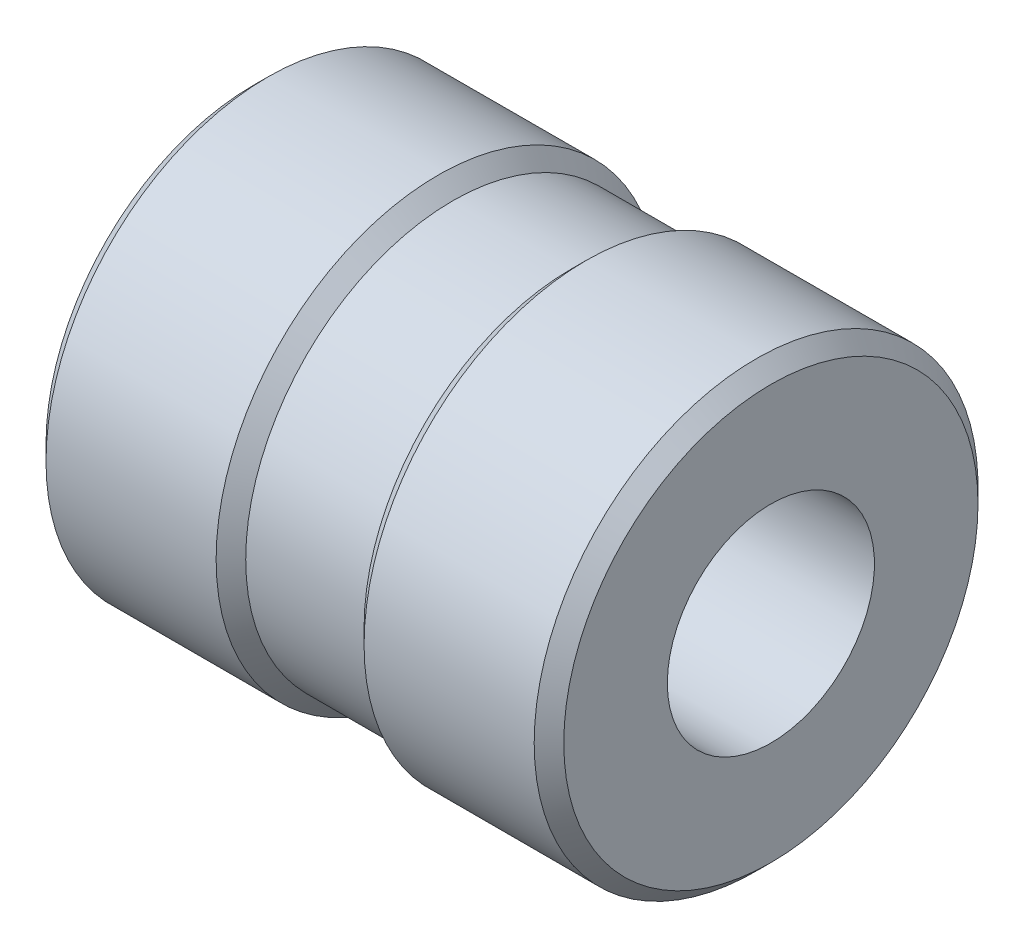
ISO-10303-21;
HEADER;
FILE_DESCRIPTION(('STEP AP214'),'2;1');
FILE_NAME('part.step','',(''),(''),'','','');
FILE_SCHEMA(('AUTOMOTIVE_DESIGN { 1 0 10303 214 1 1 1 1 }'));
ENDSEC;
DATA;
#1=APPLICATION_CONTEXT('core data for automotive mechanical design processes');
#2=APPLICATION_PROTOCOL_DEFINITION('international standard','automotive_design',2000,#1);
#3=PRODUCT_CONTEXT('',#1,'mechanical');
#4=PRODUCT('Part','Part','',(#3));
#5=PRODUCT_RELATED_PRODUCT_CATEGORY('part','',(#4));
#6=PRODUCT_DEFINITION_FORMATION('','',#4);
#7=PRODUCT_DEFINITION_CONTEXT('part definition',#1,'design');
#8=PRODUCT_DEFINITION('design','',#6,#7);
#9=PRODUCT_DEFINITION_SHAPE('','',#8);
#10=(LENGTH_UNIT() NAMED_UNIT(*) SI_UNIT(.MILLI.,.METRE.));
#11=(NAMED_UNIT(*) PLANE_ANGLE_UNIT() SI_UNIT($,.RADIAN.));
#12=(NAMED_UNIT(*) SI_UNIT($,.STERADIAN.) SOLID_ANGLE_UNIT());
#13=UNCERTAINTY_MEASURE_WITH_UNIT(LENGTH_MEASURE(1.E-05),#10,'distance_accuracy_value','');
#14=(GEOMETRIC_REPRESENTATION_CONTEXT(3) GLOBAL_UNCERTAINTY_ASSIGNED_CONTEXT((#13)) GLOBAL_UNIT_ASSIGNED_CONTEXT((#10,
#11,#12)) REPRESENTATION_CONTEXT('',''));
#15=CARTESIAN_POINT('',(0.,0.,0.));
#16=DIRECTION('',(0.,0.,1.));
#17=DIRECTION('',(1.,0.,0.));
#18=AXIS2_PLACEMENT_3D('',#15,#16,#17);
#19=CARTESIAN_POINT('',(0.,0.,0.));
#20=DIRECTION('',(-1.,0.,0.));
#21=DIRECTION('',(0.,0.,1.));
#22=AXIS2_PLACEMENT_3D('',#19,#20,#21);
#23=CYLINDRICAL_SURFACE('',#22,15.);
#24=CARTESIAN_POINT('',(-5.,0.,0.));
#25=DIRECTION('',(-1.,0.,0.));
#26=DIRECTION('',(0.,0.,1.));
#27=AXIS2_PLACEMENT_3D('',#24,#25,#26);
#28=CIRCLE('',#27,15.);
#29=CARTESIAN_POINT('',(-5.,0.,15.));
#30=VERTEX_POINT('',#29);
#31=EDGE_CURVE('E52',#30,#30,#28,.T.);
#32=ORIENTED_EDGE('',*,*,#31,.T.);
#33=EDGE_LOOP('',(#32));
#34=FACE_BOUND('',#33,.T.);
#35=CARTESIAN_POINT('',(-16.5,0.,0.));
#36=DIRECTION('',(1.,0.,0.));
#37=DIRECTION('',(0.,0.,-1.));
#38=AXIS2_PLACEMENT_3D('',#35,#36,#37);
#39=CIRCLE('',#38,15.);
#40=CARTESIAN_POINT('',(-16.5,0.,-15.));
#41=VERTEX_POINT('',#40);
#42=EDGE_CURVE('E60',#41,#41,#39,.T.);
#43=ORIENTED_EDGE('',*,*,#42,.T.);
#44=EDGE_LOOP('',(#43));
#45=FACE_BOUND('',#44,.T.);
#46=ADVANCED_FACE('F41',(#34,#45),#23,.T.);
#47=CARTESIAN_POINT('',(-17.5,15.,0.));
#48=DIRECTION('',(1.,0.,0.));
#49=DIRECTION('',(0.,0.,-1.));
#50=AXIS2_PLACEMENT_3D('',#47,#48,#49);
#51=PLANE('',#50);
#52=CARTESIAN_POINT('',(-17.5,0.,0.));
#53=DIRECTION('',(1.,0.,0.));
#54=DIRECTION('',(0.,0.,-1.));
#55=AXIS2_PLACEMENT_3D('',#52,#53,#54);
#56=CIRCLE('',#55,14.);
#57=CARTESIAN_POINT('',(-17.5,0.,-14.));
#58=VERTEX_POINT('',#57);
#59=EDGE_CURVE('E47',#58,#58,#56,.F.);
#60=ORIENTED_EDGE('',*,*,#59,.T.);
#61=EDGE_LOOP('',(#60));
#62=FACE_BOUND('',#61,.T.);
#63=CARTESIAN_POINT('',(-17.5,0.,0.));
#64=DIRECTION('',(-1.,0.,0.));
#65=DIRECTION('',(0.,0.,1.));
#66=AXIS2_PLACEMENT_3D('',#63,#64,#65);
#67=CIRCLE('',#66,7.);
#68=CARTESIAN_POINT('',(-17.5,0.,7.));
#69=VERTEX_POINT('',#68);
#70=EDGE_CURVE('E68',#69,#69,#67,.T.);
#71=ORIENTED_EDGE('',*,*,#70,.F.);
#72=EDGE_LOOP('',(#71));
#73=FACE_BOUND('',#72,.T.);
#74=ADVANCED_FACE('F120',(#62,#73),#51,.F.);
#75=CARTESIAN_POINT('',(0.,0.,0.));
#76=DIRECTION('',(-1.,0.,0.));
#77=DIRECTION('',(0.,0.,1.));
#78=AXIS2_PLACEMENT_3D('',#75,#76,#77);
#79=CYLINDRICAL_SURFACE('',#78,7.);
#80=CARTESIAN_POINT('',(-3.5,0.,0.));
#81=DIRECTION('',(-1.,0.,0.));
#82=DIRECTION('',(0.,0.,1.));
#83=AXIS2_PLACEMENT_3D('',#80,#81,#82);
#84=CIRCLE('',#83,7.);
#85=CARTESIAN_POINT('',(-3.5,0.,7.));
#86=VERTEX_POINT('',#85);
#87=EDGE_CURVE('E73',#86,#86,#84,.T.);
#88=ORIENTED_EDGE('',*,*,#87,.F.);
#89=EDGE_LOOP('',(#88));
#90=FACE_BOUND('',#89,.T.);
#91=ORIENTED_EDGE('',*,*,#70,.T.);
#92=EDGE_LOOP('',(#91));
#93=FACE_BOUND('',#92,.T.);
#94=ADVANCED_FACE('F125',(#90,#93),#79,.F.);
#95=CARTESIAN_POINT('',(-3.5,7.,0.));
#96=DIRECTION('',(1.,0.,0.));
#97=DIRECTION('',(0.,0.,-1.));
#98=AXIS2_PLACEMENT_3D('',#95,#96,#97);
#99=PLANE('',#98);
#100=CARTESIAN_POINT('',(-3.5,0.,0.));
#101=DIRECTION('',(-1.,0.,0.));
#102=DIRECTION('',(0.,0.,1.));
#103=AXIS2_PLACEMENT_3D('',#100,#101,#102);
#104=CIRCLE('',#103,2.);
#105=CARTESIAN_POINT('',(-3.5,0.,2.));
#106=VERTEX_POINT('',#105);
#107=EDGE_CURVE('E72',#106,#106,#104,.T.);
#108=ORIENTED_EDGE('',*,*,#107,.F.);
#109=EDGE_LOOP('',(#108));
#110=FACE_BOUND('',#109,.T.);
#111=ORIENTED_EDGE('',*,*,#87,.T.);
#112=EDGE_LOOP('',(#111));
#113=FACE_BOUND('',#112,.T.);
#114=ADVANCED_FACE('F127',(#110,#113),#99,.F.);
#115=CARTESIAN_POINT('',(0.,0.,0.));
#116=DIRECTION('',(-1.,0.,0.));
#117=DIRECTION('',(0.,0.,1.));
#118=AXIS2_PLACEMENT_3D('',#115,#116,#117);
#119=CYLINDRICAL_SURFACE('',#118,2.);
#120=CARTESIAN_POINT('',(3.5,0.,0.));
#121=DIRECTION('',(-1.,0.,0.));
#122=DIRECTION('',(0.,0.,1.));
#123=AXIS2_PLACEMENT_3D('',#120,#121,#122);
#124=CIRCLE('',#123,2.);
#125=CARTESIAN_POINT('',(3.5,0.,2.));
#126=VERTEX_POINT('',#125);
#127=EDGE_CURVE('E80',#126,#126,#124,.T.);
#128=ORIENTED_EDGE('',*,*,#127,.F.);
#129=EDGE_LOOP('',(#128));
#130=FACE_BOUND('',#129,.T.);
#131=ORIENTED_EDGE('',*,*,#107,.T.);
#132=EDGE_LOOP('',(#131));
#133=FACE_BOUND('',#132,.T.);
#134=ADVANCED_FACE('F135',(#130,#133),#119,.F.);
#135=CARTESIAN_POINT('',(3.5,2.,0.));
#136=DIRECTION('',(-1.,0.,0.));
#137=DIRECTION('',(0.,0.,1.));
#138=AXIS2_PLACEMENT_3D('',#135,#136,#137);
#139=PLANE('',#138);
#140=CARTESIAN_POINT('',(3.5,0.,0.));
#141=DIRECTION('',(-1.,0.,0.));
#142=DIRECTION('',(0.,0.,1.));
#143=AXIS2_PLACEMENT_3D('',#140,#141,#142);
#144=CIRCLE('',#143,7.);
#145=CARTESIAN_POINT('',(3.5,0.,7.));
#146=VERTEX_POINT('',#145);
#147=EDGE_CURVE('E79',#146,#146,#144,.T.);
#148=ORIENTED_EDGE('',*,*,#147,.F.);
#149=EDGE_LOOP('',(#148));
#150=FACE_BOUND('',#149,.T.);
#151=ORIENTED_EDGE('',*,*,#127,.T.);
#152=EDGE_LOOP('',(#151));
#153=FACE_BOUND('',#152,.T.);
#154=ADVANCED_FACE('F138',(#150,#153),#139,.F.);
#155=CARTESIAN_POINT('',(0.,0.,0.));
#156=DIRECTION('',(-1.,0.,0.));
#157=DIRECTION('',(0.,0.,1.));
#158=AXIS2_PLACEMENT_3D('',#155,#156,#157);
#159=CYLINDRICAL_SURFACE('',#158,7.);
#160=CARTESIAN_POINT('',(17.5,0.,0.));
#161=DIRECTION('',(-1.,0.,0.));
#162=DIRECTION('',(0.,0.,1.));
#163=AXIS2_PLACEMENT_3D('',#160,#161,#162);
#164=CIRCLE('',#163,7.);
#165=CARTESIAN_POINT('',(17.5,0.,7.));
#166=VERTEX_POINT('',#165);
#167=EDGE_CURVE('E81',#166,#166,#164,.T.);
#168=ORIENTED_EDGE('',*,*,#167,.F.);
#169=EDGE_LOOP('',(#168));
#170=FACE_BOUND('',#169,.T.);
#171=ORIENTED_EDGE('',*,*,#147,.T.);
#172=EDGE_LOOP('',(#171));
#173=FACE_BOUND('',#172,.T.);
#174=ADVANCED_FACE('F136',(#170,#173),#159,.F.);
#175=CARTESIAN_POINT('',(17.5,7.,0.));
#176=DIRECTION('',(-1.,0.,0.));
#177=DIRECTION('',(0.,0.,1.));
#178=AXIS2_PLACEMENT_3D('',#175,#176,#177);
#179=PLANE('',#178);
#180=CARTESIAN_POINT('',(17.5,0.,0.));
#181=DIRECTION('',(-1.,0.,0.));
#182=DIRECTION('',(0.,0.,1.));
#183=AXIS2_PLACEMENT_3D('',#180,#181,#182);
#184=CIRCLE('',#183,14.);
#185=CARTESIAN_POINT('',(17.5,0.,14.));
#186=VERTEX_POINT('',#185);
#187=EDGE_CURVE('E10',#186,#186,#184,.F.);
#188=ORIENTED_EDGE('',*,*,#187,.T.);
#189=EDGE_LOOP('',(#188));
#190=FACE_BOUND('',#189,.T.);
#191=ORIENTED_EDGE('',*,*,#167,.T.);
#192=EDGE_LOOP('',(#191));
#193=FACE_BOUND('',#192,.T.);
#194=ADVANCED_FACE('F144',(#190,#193),#179,.F.);
#195=CARTESIAN_POINT('',(0.,0.,0.));
#196=DIRECTION('',(-1.,0.,0.));
#197=DIRECTION('',(0.,0.,1.));
#198=AXIS2_PLACEMENT_3D('',#195,#196,#197);
#199=CYLINDRICAL_SURFACE('',#198,15.);
#200=CARTESIAN_POINT('',(4.99999999999999,0.,0.));
#201=DIRECTION('',(1.,0.,0.));
#202=DIRECTION('',(0.,0.,-1.));
#203=AXIS2_PLACEMENT_3D('',#200,#201,#202);
#204=CIRCLE('',#203,15.);
#205=CARTESIAN_POINT('',(4.99999999999999,0.,-15.));
#206=VERTEX_POINT('',#205);
#207=EDGE_CURVE('E64',#206,#206,#204,.T.);
#208=ORIENTED_EDGE('',*,*,#207,.T.);
#209=EDGE_LOOP('',(#208));
#210=FACE_BOUND('',#209,.T.);
#211=CARTESIAN_POINT('',(16.5,0.,0.));
#212=DIRECTION('',(-1.,0.,0.));
#213=DIRECTION('',(0.,0.,1.));
#214=AXIS2_PLACEMENT_3D('',#211,#212,#213);
#215=CIRCLE('',#214,15.);
#216=CARTESIAN_POINT('',(16.5,0.,15.));
#217=VERTEX_POINT('',#216);
#218=EDGE_CURVE('E61',#217,#217,#215,.T.);
#219=ORIENTED_EDGE('',*,*,#218,.T.);
#220=EDGE_LOOP('',(#219));
#221=FACE_BOUND('',#220,.T.);
#222=ADVANCED_FACE('F99',(#210,#221),#199,.T.);
#223=CARTESIAN_POINT('',(0.,0.,0.));
#224=DIRECTION('',(-1.,0.,0.));
#225=DIRECTION('',(0.,0.,1.));
#226=AXIS2_PLACEMENT_3D('',#223,#224,#225);
#227=CYLINDRICAL_SURFACE('',#226,14.);
#228=CARTESIAN_POINT('',(-4.,0.,0.));
#229=DIRECTION('',(-1.,0.,0.));
#230=DIRECTION('',(0.,0.,1.));
#231=AXIS2_PLACEMENT_3D('',#228,#229,#230);
#232=CIRCLE('',#231,14.);
#233=CARTESIAN_POINT('',(-4.,0.,14.));
#234=VERTEX_POINT('',#233);
#235=EDGE_CURVE('E90',#234,#234,#232,.T.);
#236=ORIENTED_EDGE('',*,*,#235,.F.);
#237=EDGE_LOOP('',(#236));
#238=FACE_BOUND('',#237,.T.);
#239=CARTESIAN_POINT('',(4.,0.,0.));
#240=DIRECTION('',(-1.,0.,0.));
#241=DIRECTION('',(0.,0.,1.));
#242=AXIS2_PLACEMENT_3D('',#239,#240,#241);
#243=CIRCLE('',#242,14.);
#244=CARTESIAN_POINT('',(4.,0.,14.));
#245=VERTEX_POINT('',#244);
#246=EDGE_CURVE('E88',#245,#245,#243,.T.);
#247=ORIENTED_EDGE('',*,*,#246,.T.);
#248=EDGE_LOOP('',(#247));
#249=FACE_BOUND('',#248,.T.);
#250=ADVANCED_FACE('F98',(#238,#249),#227,.T.);
#251=CARTESIAN_POINT('',(4.,0.,0.));
#252=DIRECTION('',(1.,0.,0.));
#253=DIRECTION('',(0.,0.,-1.));
#254=AXIS2_PLACEMENT_3D('',#251,#252,#253);
#255=CONICAL_SURFACE('',#254,14.,0.785398163397445);
#256=ORIENTED_EDGE('',*,*,#207,.F.);
#257=EDGE_LOOP('',(#256));
#258=FACE_BOUND('',#257,.T.);
#259=ORIENTED_EDGE('',*,*,#246,.F.);
#260=EDGE_LOOP('',(#259));
#261=FACE_BOUND('',#260,.T.);
#262=ADVANCED_FACE('F97',(#258,#261),#255,.T.);
#263=CARTESIAN_POINT('',(-5.,0.,0.));
#264=DIRECTION('',(-1.,0.,0.));
#265=DIRECTION('',(0.,0.,1.));
#266=AXIS2_PLACEMENT_3D('',#263,#264,#265);
#267=CONICAL_SURFACE('',#266,15.,0.785398163397447);
#268=ORIENTED_EDGE('',*,*,#235,.T.);
#269=EDGE_LOOP('',(#268));
#270=FACE_BOUND('',#269,.T.);
#271=ORIENTED_EDGE('',*,*,#31,.F.);
#272=EDGE_LOOP('',(#271));
#273=FACE_BOUND('',#272,.T.);
#274=ADVANCED_FACE('F93',(#270,#273),#267,.T.);
#275=CARTESIAN_POINT('',(-17.5,0.,0.));
#276=DIRECTION('',(1.,0.,0.));
#277=DIRECTION('',(0.,0.,-1.));
#278=AXIS2_PLACEMENT_3D('',#275,#276,#277);
#279=CONICAL_SURFACE('',#278,14.,0.785398163397447);
#280=ORIENTED_EDGE('',*,*,#42,.F.);
#281=EDGE_LOOP('',(#280));
#282=FACE_BOUND('',#281,.T.);
#283=ORIENTED_EDGE('',*,*,#59,.F.);
#284=EDGE_LOOP('',(#283));
#285=FACE_BOUND('',#284,.T.);
#286=ADVANCED_FACE('F113',(#282,#285),#279,.T.);
#287=CARTESIAN_POINT('',(16.5,0.,0.));
#288=DIRECTION('',(-1.,0.,0.));
#289=DIRECTION('',(0.,0.,1.));
#290=AXIS2_PLACEMENT_3D('',#287,#288,#289);
#291=CONICAL_SURFACE('',#290,15.,0.785398163397447);
#292=ORIENTED_EDGE('',*,*,#187,.F.);
#293=EDGE_LOOP('',(#292));
#294=FACE_BOUND('',#293,.T.);
#295=ORIENTED_EDGE('',*,*,#218,.F.);
#296=EDGE_LOOP('',(#295));
#297=FACE_BOUND('',#296,.T.);
#298=ADVANCED_FACE('F42',(#294,#297),#291,.T.);
#299=CLOSED_SHELL('',(#46,#74,#94,#114,#134,#154,#174,#194,#222,#250,#262,#274,#286,#298));
#300=MANIFOLD_SOLID_BREP('B2',#299);
#301=ADVANCED_BREP_SHAPE_REPRESENTATION('',(#18,#300),#14);
#302=SHAPE_DEFINITION_REPRESENTATION(#9,#301);
ENDSEC;
END-ISO-10303-21;
